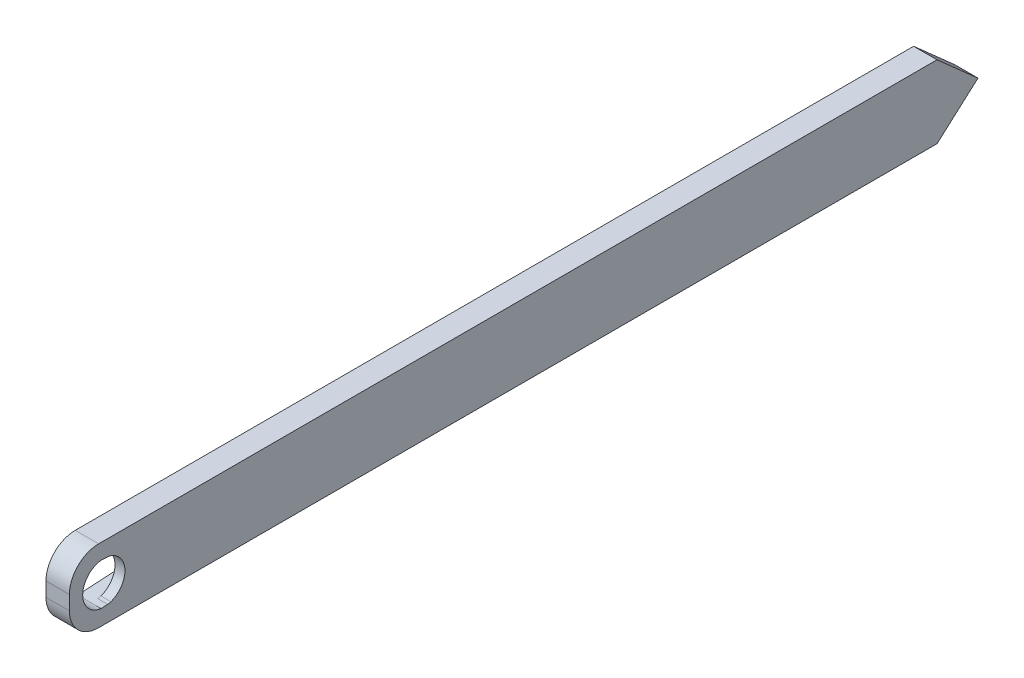
ISO-10303-21;
HEADER;
FILE_DESCRIPTION(('STEP AP214'),'2;1');
FILE_NAME('part.step','',(''),(''),'','','');
FILE_SCHEMA(('AUTOMOTIVE_DESIGN { 1 0 10303 214 1 1 1 1 }'));
ENDSEC;
DATA;
#1=APPLICATION_CONTEXT('core data for automotive mechanical design processes');
#2=APPLICATION_PROTOCOL_DEFINITION('international standard','automotive_design',2000,#1);
#3=PRODUCT_CONTEXT('',#1,'mechanical');
#4=PRODUCT('Part','Part','',(#3));
#5=PRODUCT_RELATED_PRODUCT_CATEGORY('part','',(#4));
#6=PRODUCT_DEFINITION_FORMATION('','',#4);
#7=PRODUCT_DEFINITION_CONTEXT('part definition',#1,'design');
#8=PRODUCT_DEFINITION('design','',#6,#7);
#9=PRODUCT_DEFINITION_SHAPE('','',#8);
#10=(LENGTH_UNIT() NAMED_UNIT(*) SI_UNIT(.MILLI.,.METRE.));
#11=(NAMED_UNIT(*) PLANE_ANGLE_UNIT() SI_UNIT($,.RADIAN.));
#12=(NAMED_UNIT(*) SI_UNIT($,.STERADIAN.) SOLID_ANGLE_UNIT());
#13=UNCERTAINTY_MEASURE_WITH_UNIT(LENGTH_MEASURE(1.E-05),#10,'distance_accuracy_value','');
#14=(GEOMETRIC_REPRESENTATION_CONTEXT(3) GLOBAL_UNCERTAINTY_ASSIGNED_CONTEXT((#13)) GLOBAL_UNIT_ASSIGNED_CONTEXT((#10,
#11,#12)) REPRESENTATION_CONTEXT('',''));
#15=CARTESIAN_POINT('',(0.,0.,0.));
#16=DIRECTION('',(0.,0.,1.));
#17=DIRECTION('',(1.,0.,0.));
#18=AXIS2_PLACEMENT_3D('',#15,#16,#17);
#19=CARTESIAN_POINT('',(4.,0.,0.));
#20=DIRECTION('',(0.,1.,0.));
#21=DIRECTION('',(0.,0.,1.));
#22=AXIS2_PLACEMENT_3D('',#19,#20,#21);
#23=PLANE('',#22);
#24=DIRECTION('',(0.,0.,-1.));
#25=VECTOR('',#24,1.);
#26=CARTESIAN_POINT('',(4.,0.,0.));
#27=LINE('',#26,#25);
#28=CARTESIAN_POINT('',(4.,0.,-5.));
#29=VERTEX_POINT('',#28);
#30=CARTESIAN_POINT('',(4.,0.,-148.25));
#31=VERTEX_POINT('',#30);
#32=EDGE_CURVE('E204',#29,#31,#27,.T.);
#33=ORIENTED_EDGE('',*,*,#32,.F.);
#34=DIRECTION('',(-1.,0.,0.));
#35=VECTOR('',#34,1.);
#36=CARTESIAN_POINT('',(0.,0.,-5.));
#37=LINE('',#36,#35);
#38=CARTESIAN_POINT('',(0.,0.,-5.));
#39=VERTEX_POINT('',#38);
#40=EDGE_CURVE('E252',#29,#39,#37,.T.);
#41=ORIENTED_EDGE('',*,*,#40,.T.);
#42=DIRECTION('',(0.,0.,-1.));
#43=VECTOR('',#42,1.);
#44=CARTESIAN_POINT('',(0.,0.,0.));
#45=LINE('',#44,#43);
#46=CARTESIAN_POINT('',(0.,0.,-148.25));
#47=VERTEX_POINT('',#46);
#48=EDGE_CURVE('E201',#39,#47,#45,.T.);
#49=ORIENTED_EDGE('',*,*,#48,.T.);
#50=DIRECTION('',(-1.,0.,0.));
#51=VECTOR('',#50,1.);
#52=CARTESIAN_POINT('',(4.,0.,-148.25));
#53=LINE('',#52,#51);
#54=EDGE_CURVE('E234',#31,#47,#53,.T.);
#55=ORIENTED_EDGE('',*,*,#54,.F.);
#56=EDGE_LOOP('',(#33,#41,#49,#55));
#57=FACE_BOUND('',#56,.T.);
#58=ADVANCED_FACE('F47',(#57),#23,.F.);
#59=CARTESIAN_POINT('',(4.,-73.596685171206,-65.2907735590273));
#60=DIRECTION('',(0.,-0.748057524733294,-0.66363388979911));
#61=DIRECTION('',(0.,0.66363388979911,-0.748057524733294));
#62=AXIS2_PLACEMENT_3D('',#59,#60,#61);
#63=PLANE('',#62);
#64=DIRECTION('',(0.,-0.66363388979911,0.748057524733294));
#65=VECTOR('',#64,1.);
#66=CARTESIAN_POINT('',(0.,-73.596685171206,-65.2907735590273));
#67=LINE('',#66,#65);
#68=CARTESIAN_POINT('',(0.,6.20999999999998,-155.25));
#69=VERTEX_POINT('',#68);
#70=EDGE_CURVE('E220',#69,#47,#67,.T.);
#71=ORIENTED_EDGE('',*,*,#70,.F.);
#72=DIRECTION('',(-1.,0.,0.));
#73=VECTOR('',#72,1.);
#74=CARTESIAN_POINT('',(4.,6.20999999999998,-155.25));
#75=LINE('',#74,#73);
#76=CARTESIAN_POINT('',(4.,6.20999999999998,-155.25));
#77=VERTEX_POINT('',#76);
#78=EDGE_CURVE('E232',#77,#69,#75,.T.);
#79=ORIENTED_EDGE('',*,*,#78,.F.);
#80=DIRECTION('',(0.,-0.66363388979911,0.748057524733294));
#81=VECTOR('',#80,1.);
#82=CARTESIAN_POINT('',(4.,-73.596685171206,-65.2907735590273));
#83=LINE('',#82,#81);
#84=EDGE_CURVE('E206',#77,#31,#83,.T.);
#85=ORIENTED_EDGE('',*,*,#84,.T.);
#86=ORIENTED_EDGE('',*,*,#54,.T.);
#87=EDGE_LOOP('',(#71,#79,#85,#86));
#88=FACE_BOUND('',#87,.T.);
#89=ADVANCED_FACE('F302',(#88),#63,.T.);
#90=CARTESIAN_POINT('',(4.,80.5467937202575,-71.4565127146858));
#91=DIRECTION('',(0.,0.748057524733294,-0.66363388979911));
#92=DIRECTION('',(0.,0.66363388979911,0.748057524733294));
#93=AXIS2_PLACEMENT_3D('',#90,#91,#92);
#94=PLANE('',#93);
#95=DIRECTION('',(0.,-0.66363388979911,-0.748057524733294));
#96=VECTOR('',#95,1.);
#97=CARTESIAN_POINT('',(0.,80.5467937202575,-71.4565127146858));
#98=LINE('',#97,#96);
#99=CARTESIAN_POINT('',(0.,12.42,-148.25));
#100=VERTEX_POINT('',#99);
#101=EDGE_CURVE('E223',#100,#69,#98,.T.);
#102=ORIENTED_EDGE('',*,*,#101,.F.);
#103=DIRECTION('',(-1.,0.,0.));
#104=VECTOR('',#103,1.);
#105=CARTESIAN_POINT('',(4.,12.42,-148.25));
#106=LINE('',#105,#104);
#107=CARTESIAN_POINT('',(4.,12.42,-148.25));
#108=VERTEX_POINT('',#107);
#109=EDGE_CURVE('E218',#108,#100,#106,.T.);
#110=ORIENTED_EDGE('',*,*,#109,.F.);
#111=DIRECTION('',(0.,-0.66363388979911,-0.748057524733294));
#112=VECTOR('',#111,1.);
#113=CARTESIAN_POINT('',(4.,80.5467937202575,-71.4565127146858));
#114=LINE('',#113,#112);
#115=EDGE_CURVE('E210',#108,#77,#114,.T.);
#116=ORIENTED_EDGE('',*,*,#115,.T.);
#117=ORIENTED_EDGE('',*,*,#78,.T.);
#118=EDGE_LOOP('',(#102,#110,#116,#117));
#119=FACE_BOUND('',#118,.T.);
#120=ADVANCED_FACE('F310',(#119),#94,.T.);
#121=CARTESIAN_POINT('',(4.,12.42,0.));
#122=DIRECTION('',(0.,1.,0.));
#123=DIRECTION('',(0.,0.,1.));
#124=AXIS2_PLACEMENT_3D('',#121,#122,#123);
#125=PLANE('',#124);
#126=DIRECTION('',(0.,0.,-1.));
#127=VECTOR('',#126,1.);
#128=CARTESIAN_POINT('',(0.,12.42,0.));
#129=LINE('',#128,#127);
#130=CARTESIAN_POINT('',(0.,12.42,-5.));
#131=VERTEX_POINT('',#130);
#132=EDGE_CURVE('E226',#131,#100,#129,.T.);
#133=ORIENTED_EDGE('',*,*,#132,.F.);
#134=DIRECTION('',(-1.,0.,0.));
#135=VECTOR('',#134,1.);
#136=CARTESIAN_POINT('',(4.,12.42,-5.));
#137=LINE('',#136,#135);
#138=CARTESIAN_POINT('',(4.,12.42,-5.));
#139=VERTEX_POINT('',#138);
#140=EDGE_CURVE('E246',#131,#139,#137,.F.);
#141=ORIENTED_EDGE('',*,*,#140,.T.);
#142=DIRECTION('',(0.,0.,-1.));
#143=VECTOR('',#142,1.);
#144=CARTESIAN_POINT('',(4.,12.42,0.));
#145=LINE('',#144,#143);
#146=EDGE_CURVE('E213',#139,#108,#145,.T.);
#147=ORIENTED_EDGE('',*,*,#146,.T.);
#148=ORIENTED_EDGE('',*,*,#109,.T.);
#149=EDGE_LOOP('',(#133,#141,#147,#148));
#150=FACE_BOUND('',#149,.T.);
#151=ADVANCED_FACE('F410',(#150),#125,.T.);
#152=CARTESIAN_POINT('',(4.,0.,0.));
#153=DIRECTION('',(0.,0.,1.));
#154=DIRECTION('',(1.,0.,0.));
#155=AXIS2_PLACEMENT_3D('',#152,#153,#154);
#156=PLANE('',#155);
#157=DIRECTION('',(0.,1.,0.));
#158=VECTOR('',#157,1.);
#159=CARTESIAN_POINT('',(4.,0.,0.));
#160=LINE('',#159,#158);
#161=CARTESIAN_POINT('',(4.,5.,0.));
#162=VERTEX_POINT('',#161);
#163=CARTESIAN_POINT('',(4.,7.42,0.));
#164=VERTEX_POINT('',#163);
#165=EDGE_CURVE('E215',#162,#164,#160,.T.);
#166=ORIENTED_EDGE('',*,*,#165,.T.);
#167=DIRECTION('',(-1.,0.,0.));
#168=VECTOR('',#167,1.);
#169=CARTESIAN_POINT('',(4.,7.42,0.));
#170=LINE('',#169,#168);
#171=CARTESIAN_POINT('',(0.,7.42,0.));
#172=VERTEX_POINT('',#171);
#173=EDGE_CURVE('E239',#164,#172,#170,.T.);
#174=ORIENTED_EDGE('',*,*,#173,.T.);
#175=DIRECTION('',(0.,1.,0.));
#176=VECTOR('',#175,1.);
#177=CARTESIAN_POINT('',(0.,0.,0.));
#178=LINE('',#177,#176);
#179=CARTESIAN_POINT('',(0.,5.,0.));
#180=VERTEX_POINT('',#179);
#181=EDGE_CURVE('E207',#180,#172,#178,.T.);
#182=ORIENTED_EDGE('',*,*,#181,.F.);
#183=DIRECTION('',(-1.,0.,0.));
#184=VECTOR('',#183,1.);
#185=CARTESIAN_POINT('',(4.,5.,0.));
#186=LINE('',#185,#184);
#187=EDGE_CURVE('E237',#180,#162,#186,.F.);
#188=ORIENTED_EDGE('',*,*,#187,.T.);
#189=EDGE_LOOP('',(#166,#174,#182,#188));
#190=FACE_BOUND('',#189,.T.);
#191=ADVANCED_FACE('F403',(#190),#156,.T.);
#192=CARTESIAN_POINT('',(4.,0.,0.));
#193=DIRECTION('',(1.,0.,0.));
#194=DIRECTION('',(0.,0.,-1.));
#195=AXIS2_PLACEMENT_3D('',#192,#193,#194);
#196=PLANE('',#195);
#197=DIRECTION('',(0.,-0.0596337664255842,-0.998220323326418));
#198=VECTOR('',#197,1.);
#199=CARTESIAN_POINT('',(4.,10.0775607204516,-0.602034328594348));
#200=LINE('',#199,#198);
#201=CARTESIAN_POINT('',(4.,9.78999999999999,-5.41556485921069));
#202=VERTEX_POINT('',#201);
#203=CARTESIAN_POINT('',(4.,9.72280735048438,-6.54031468376415));
#204=VERTEX_POINT('',#203);
#205=EDGE_CURVE('E185',#202,#204,#200,.T.);
#206=ORIENTED_EDGE('',*,*,#205,.T.);
#207=CARTESIAN_POINT('',(4.,7.72636670383154,-6.42104715091298));
#208=DIRECTION('',(1.,0.,0.));
#209=DIRECTION('',(0.,0.,-1.));
#210=AXIS2_PLACEMENT_3D('',#207,#208,#209);
#211=CIRCLE('',#210,2.);
#212=CARTESIAN_POINT('',(4.,9.61005205020613,-7.0931554129167));
#213=VERTEX_POINT('',#212);
#214=EDGE_CURVE('E12',#204,#213,#211,.F.);
#215=ORIENTED_EDGE('',*,*,#214,.T.);
#216=CARTESIAN_POINT('',(4.,6.21,-5.88));
#217=DIRECTION('',(-1.,0.,0.));
#218=DIRECTION('',(0.,0.,1.));
#219=AXIS2_PLACEMENT_3D('',#216,#217,#218);
#220=CIRCLE('',#219,3.61);
#221=CARTESIAN_POINT('',(4.,2.80994794979384,-7.0931554129166));
#222=VERTEX_POINT('',#221);
#223=EDGE_CURVE('E187',#213,#222,#220,.T.);
#224=ORIENTED_EDGE('',*,*,#223,.T.);
#225=CARTESIAN_POINT('',(4.,4.69363329616844,-6.42104715091294));
#226=DIRECTION('',(1.,0.,0.));
#227=DIRECTION('',(0.,0.,-1.));
#228=AXIS2_PLACEMENT_3D('',#225,#226,#227);
#229=CIRCLE('',#228,2.);
#230=CARTESIAN_POINT('',(4.,2.69719264951561,-6.54031468376411));
#231=VERTEX_POINT('',#230);
#232=EDGE_CURVE('E264',#222,#231,#229,.F.);
#233=ORIENTED_EDGE('',*,*,#232,.T.);
#234=DIRECTION('',(0.,-0.0596337664255851,0.998220323326418));
#235=VECTOR('',#234,1.);
#236=CARTESIAN_POINT('',(4.,2.29827144820995,0.137298930428936));
#237=LINE('',#236,#235);
#238=CARTESIAN_POINT('',(4.,2.62999999999999,-5.41556485921071));
#239=VERTEX_POINT('',#238);
#240=EDGE_CURVE('E191',#231,#239,#237,.T.);
#241=ORIENTED_EDGE('',*,*,#240,.T.);
#242=EDGE_CURVE('E192',#239,#202,#220,.T.);
#243=ORIENTED_EDGE('',*,*,#242,.T.);
#244=EDGE_LOOP('',(#206,#215,#224,#233,#241,#243));
#245=FACE_BOUND('',#244,.T.);
#246=ORIENTED_EDGE('',*,*,#146,.F.);
#247=CARTESIAN_POINT('',(4.,7.42,-5.));
#248=DIRECTION('',(1.,0.,0.));
#249=DIRECTION('',(0.,0.,-1.));
#250=AXIS2_PLACEMENT_3D('',#247,#248,#249);
#251=CIRCLE('',#250,5.);
#252=EDGE_CURVE('E250',#139,#164,#251,.T.);
#253=ORIENTED_EDGE('',*,*,#252,.T.);
#254=ORIENTED_EDGE('',*,*,#165,.F.);
#255=CARTESIAN_POINT('',(4.,5.,-5.));
#256=DIRECTION('',(1.,0.,0.));
#257=DIRECTION('',(0.,0.,-1.));
#258=AXIS2_PLACEMENT_3D('',#255,#256,#257);
#259=CIRCLE('',#258,5.);
#260=EDGE_CURVE('E248',#162,#29,#259,.T.);
#261=ORIENTED_EDGE('',*,*,#260,.T.);
#262=ORIENTED_EDGE('',*,*,#32,.T.);
#263=ORIENTED_EDGE('',*,*,#84,.F.);
#264=ORIENTED_EDGE('',*,*,#115,.F.);
#265=EDGE_LOOP('',(#246,#253,#254,#261,#262,#263,#264));
#266=FACE_BOUND('',#265,.T.);
#267=ADVANCED_FACE('F271',(#245,#266),#196,.T.);
#268=CARTESIAN_POINT('',(0.,0.,0.));
#269=DIRECTION('',(1.,0.,0.));
#270=DIRECTION('',(0.,0.,-1.));
#271=AXIS2_PLACEMENT_3D('',#268,#269,#270);
#272=PLANE('',#271);
#273=DIRECTION('',(0.,-0.0596337664255851,0.998220323326418));
#274=VECTOR('',#273,1.);
#275=CARTESIAN_POINT('',(0.,2.29827144820995,0.137298930428936));
#276=LINE('',#275,#274);
#277=CARTESIAN_POINT('',(0.,3.705,-23.410182873402));
#278=VERTEX_POINT('',#277);
#279=CARTESIAN_POINT('',(0.,2.62999999999999,-5.41556485921071));
#280=VERTEX_POINT('',#279);
#281=EDGE_CURVE('E195',#278,#280,#276,.T.);
#282=ORIENTED_EDGE('',*,*,#281,.F.);
#283=CARTESIAN_POINT('',(0.,6.21,-23.2605339618287));
#284=DIRECTION('',(-1.,0.,0.));
#285=DIRECTION('',(0.,0.,1.));
#286=AXIS2_PLACEMENT_3D('',#283,#284,#285);
#287=CIRCLE('',#286,2.50946603817128);
#288=CARTESIAN_POINT('',(0.,8.715,-23.410182873402));
#289=VERTEX_POINT('',#288);
#290=EDGE_CURVE('E172',#289,#278,#287,.T.);
#291=ORIENTED_EDGE('',*,*,#290,.F.);
#292=DIRECTION('',(0.,-0.0596337664255842,-0.998220323326418));
#293=VECTOR('',#292,1.);
#294=CARTESIAN_POINT('',(0.,10.0775607204516,-0.602034328594348));
#295=LINE('',#294,#293);
#296=CARTESIAN_POINT('',(0.,9.78999999999999,-5.41556485921069));
#297=VERTEX_POINT('',#296);
#298=EDGE_CURVE('E184',#297,#289,#295,.T.);
#299=ORIENTED_EDGE('',*,*,#298,.F.);
#300=CARTESIAN_POINT('',(0.,6.21,-5.88));
#301=DIRECTION('',(-1.,0.,0.));
#302=DIRECTION('',(0.,0.,1.));
#303=AXIS2_PLACEMENT_3D('',#300,#301,#302);
#304=CIRCLE('',#303,3.61);
#305=EDGE_CURVE('E188',#280,#297,#304,.T.);
#306=ORIENTED_EDGE('',*,*,#305,.F.);
#307=EDGE_LOOP('',(#282,#291,#299,#306));
#308=FACE_BOUND('',#307,.T.);
#309=ORIENTED_EDGE('',*,*,#181,.T.);
#310=CARTESIAN_POINT('',(0.,7.42,-5.));
#311=DIRECTION('',(1.,0.,0.));
#312=DIRECTION('',(0.,0.,-1.));
#313=AXIS2_PLACEMENT_3D('',#310,#311,#312);
#314=CIRCLE('',#313,5.);
#315=EDGE_CURVE('E244',#172,#131,#314,.F.);
#316=ORIENTED_EDGE('',*,*,#315,.T.);
#317=ORIENTED_EDGE('',*,*,#132,.T.);
#318=ORIENTED_EDGE('',*,*,#101,.T.);
#319=ORIENTED_EDGE('',*,*,#70,.T.);
#320=ORIENTED_EDGE('',*,*,#48,.F.);
#321=CARTESIAN_POINT('',(0.,5.,-5.));
#322=DIRECTION('',(1.,0.,0.));
#323=DIRECTION('',(0.,0.,-1.));
#324=AXIS2_PLACEMENT_3D('',#321,#322,#323);
#325=CIRCLE('',#324,5.);
#326=EDGE_CURVE('E242',#39,#180,#325,.F.);
#327=ORIENTED_EDGE('',*,*,#326,.T.);
#328=EDGE_LOOP('',(#309,#316,#317,#318,#319,#320,#327));
#329=FACE_BOUND('',#328,.T.);
#330=ADVANCED_FACE('F288',(#308,#329),#272,.F.);
#331=CARTESIAN_POINT('',(4.,10.0775607204516,-0.602034328594348));
#332=DIRECTION('',(0.,0.998220323326418,-0.0596337664255842));
#333=DIRECTION('',(0.,0.0596337664255842,0.998220323326418));
#334=AXIS2_PLACEMENT_3D('',#331,#332,#333);
#335=PLANE('',#334);
#336=DIRECTION('',(0.,-0.0596337664255842,-0.998220323326418));
#337=VECTOR('',#336,1.);
#338=CARTESIAN_POINT('',(2.3,10.0775607204516,-0.602034328594348));
#339=LINE('',#338,#337);
#340=CARTESIAN_POINT('',(2.3,9.72280735048438,-6.54031468376415));
#341=VERTEX_POINT('',#340);
#342=CARTESIAN_POINT('',(2.3,8.715,-23.410182873402));
#343=VERTEX_POINT('',#342);
#344=EDGE_CURVE('E62',#341,#343,#339,.T.);
#345=ORIENTED_EDGE('',*,*,#344,.F.);
#346=DIRECTION('',(1.,0.,0.));
#347=VECTOR('',#346,1.);
#348=CARTESIAN_POINT('',(4.,9.72280735048438,-6.54031468376415));
#349=LINE('',#348,#347);
#350=EDGE_CURVE('E67',#341,#204,#349,.T.);
#351=ORIENTED_EDGE('',*,*,#350,.T.);
#352=ORIENTED_EDGE('',*,*,#205,.F.);
#353=DIRECTION('',(-1.,0.,0.));
#354=VECTOR('',#353,1.);
#355=CARTESIAN_POINT('',(4.,9.78999999999999,-5.41556485921069));
#356=LINE('',#355,#354);
#357=EDGE_CURVE('E199',#202,#297,#356,.T.);
#358=ORIENTED_EDGE('',*,*,#357,.T.);
#359=ORIENTED_EDGE('',*,*,#298,.T.);
#360=DIRECTION('',(-1.,0.,0.));
#361=VECTOR('',#360,1.);
#362=CARTESIAN_POINT('',(24.2504211409163,8.715,-23.410182873402));
#363=LINE('',#362,#361);
#364=EDGE_CURVE('E180',#343,#289,#363,.T.);
#365=ORIENTED_EDGE('',*,*,#364,.F.);
#366=EDGE_LOOP('',(#345,#351,#352,#358,#359,#365));
#367=FACE_BOUND('',#366,.T.);
#368=ADVANCED_FACE('F286',(#367),#335,.F.);
#369=CARTESIAN_POINT('',(4.,6.21,-5.88));
#370=DIRECTION('',(-1.,0.,0.));
#371=DIRECTION('',(0.,0.,1.));
#372=AXIS2_PLACEMENT_3D('',#369,#370,#371);
#373=CYLINDRICAL_SURFACE('',#372,3.61);
#374=ORIENTED_EDGE('',*,*,#305,.T.);
#375=ORIENTED_EDGE('',*,*,#357,.F.);
#376=ORIENTED_EDGE('',*,*,#242,.F.);
#377=DIRECTION('',(-1.,0.,0.));
#378=VECTOR('',#377,1.);
#379=CARTESIAN_POINT('',(4.,2.62999999999999,-5.41556485921071));
#380=LINE('',#379,#378);
#381=EDGE_CURVE('E202',#239,#280,#380,.T.);
#382=ORIENTED_EDGE('',*,*,#381,.T.);
#383=EDGE_LOOP('',(#374,#375,#376,#382));
#384=FACE_BOUND('',#383,.T.);
#385=ADVANCED_FACE('F284',(#384),#373,.F.);
#386=CARTESIAN_POINT('',(4.,2.29827144820995,0.137298930428936));
#387=DIRECTION('',(0.,-0.998220323326418,-0.0596337664255851));
#388=DIRECTION('',(0.,0.0596337664255851,-0.998220323326418));
#389=AXIS2_PLACEMENT_3D('',#386,#387,#388);
#390=PLANE('',#389);
#391=ORIENTED_EDGE('',*,*,#240,.F.);
#392=DIRECTION('',(1.,0.,0.));
#393=VECTOR('',#392,1.);
#394=CARTESIAN_POINT('',(2.3,2.69719264951561,-6.54031468376411));
#395=LINE('',#394,#393);
#396=CARTESIAN_POINT('',(2.3,2.69719264951561,-6.54031468376411));
#397=VERTEX_POINT('',#396);
#398=EDGE_CURVE('E162',#231,#397,#395,.F.);
#399=ORIENTED_EDGE('',*,*,#398,.T.);
#400=DIRECTION('',(0.,-0.0596337664255851,0.998220323326418));
#401=VECTOR('',#400,1.);
#402=CARTESIAN_POINT('',(2.3,2.29827144820995,0.137298930428936));
#403=LINE('',#402,#401);
#404=CARTESIAN_POINT('',(2.3,3.705,-23.410182873402));
#405=VERTEX_POINT('',#404);
#406=EDGE_CURVE('E154',#405,#397,#403,.T.);
#407=ORIENTED_EDGE('',*,*,#406,.F.);
#408=DIRECTION('',(-1.,0.,0.));
#409=VECTOR('',#408,1.);
#410=CARTESIAN_POINT('',(24.2504211409163,3.705,-23.410182873402));
#411=LINE('',#410,#409);
#412=EDGE_CURVE('E159',#405,#278,#411,.T.);
#413=ORIENTED_EDGE('',*,*,#412,.T.);
#414=ORIENTED_EDGE('',*,*,#281,.T.);
#415=ORIENTED_EDGE('',*,*,#381,.F.);
#416=EDGE_LOOP('',(#391,#399,#407,#413,#414,#415));
#417=FACE_BOUND('',#416,.T.);
#418=ADVANCED_FACE('F157',(#417),#390,.F.);
#419=CARTESIAN_POINT('',(2.3,6.21,-5.88));
#420=DIRECTION('',(1.,0.,0.));
#421=DIRECTION('',(0.,0.,-1.));
#422=AXIS2_PLACEMENT_3D('',#419,#420,#421);
#423=CIRCLE('',#422,3.61);
#424=CARTESIAN_POINT('',(2.3,9.61005205020613,-7.0931554129167));
#425=VERTEX_POINT('',#424);
#426=CARTESIAN_POINT('',(2.3,2.80994794979384,-7.0931554129166));
#427=VERTEX_POINT('',#426);
#428=EDGE_CURVE('E176',#425,#427,#423,.F.);
#429=ORIENTED_EDGE('',*,*,#428,.T.);
#430=DIRECTION('',(-1.,0.,0.));
#431=VECTOR('',#430,1.);
#432=CARTESIAN_POINT('',(4.,2.80994794979384,-7.0931554129166));
#433=LINE('',#432,#431);
#434=EDGE_CURVE('E259',#427,#222,#433,.F.);
#435=ORIENTED_EDGE('',*,*,#434,.T.);
#436=ORIENTED_EDGE('',*,*,#223,.F.);
#437=DIRECTION('',(-1.,0.,0.));
#438=VECTOR('',#437,1.);
#439=CARTESIAN_POINT('',(4.,9.61005205020613,-7.0931554129167));
#440=LINE('',#439,#438);
#441=EDGE_CURVE('E256',#213,#425,#440,.T.);
#442=ORIENTED_EDGE('',*,*,#441,.T.);
#443=EDGE_LOOP('',(#429,#435,#436,#442));
#444=FACE_BOUND('',#443,.T.);
#445=ADVANCED_FACE('F276',(#444),#373,.F.);
#446=CARTESIAN_POINT('',(2.3,0.,0.));
#447=DIRECTION('',(1.,0.,0.));
#448=DIRECTION('',(0.,0.,-1.));
#449=AXIS2_PLACEMENT_3D('',#446,#447,#448);
#450=PLANE('',#449);
#451=ORIENTED_EDGE('',*,*,#344,.T.);
#452=CARTESIAN_POINT('',(2.3,6.21,-23.2605339618287));
#453=DIRECTION('',(1.,0.,0.));
#454=DIRECTION('',(0.,0.,-1.));
#455=AXIS2_PLACEMENT_3D('',#452,#453,#454);
#456=CIRCLE('',#455,2.50946603817128);
#457=EDGE_CURVE('E170',#343,#405,#456,.F.);
#458=ORIENTED_EDGE('',*,*,#457,.T.);
#459=ORIENTED_EDGE('',*,*,#406,.T.);
#460=CARTESIAN_POINT('',(2.3,4.69363329616844,-6.42104715091294));
#461=DIRECTION('',(1.,0.,0.));
#462=DIRECTION('',(0.,0.,-1.));
#463=AXIS2_PLACEMENT_3D('',#460,#461,#462);
#464=CIRCLE('',#463,2.);
#465=EDGE_CURVE('E262',#397,#427,#464,.T.);
#466=ORIENTED_EDGE('',*,*,#465,.T.);
#467=ORIENTED_EDGE('',*,*,#428,.F.);
#468=CARTESIAN_POINT('',(2.3,7.72636670383154,-6.42104715091298));
#469=DIRECTION('',(1.,0.,0.));
#470=DIRECTION('',(0.,0.,-1.));
#471=AXIS2_PLACEMENT_3D('',#468,#469,#470);
#472=CIRCLE('',#471,2.);
#473=EDGE_CURVE('E55',#425,#341,#472,.T.);
#474=ORIENTED_EDGE('',*,*,#473,.T.);
#475=EDGE_LOOP('',(#451,#458,#459,#466,#467,#474));
#476=FACE_BOUND('',#475,.T.);
#477=ADVANCED_FACE('F174',(#476),#450,.F.);
#478=CARTESIAN_POINT('',(24.2504211409163,6.21,-23.2605339618287));
#479=DIRECTION('',(-1.,0.,0.));
#480=DIRECTION('',(0.,0.,1.));
#481=AXIS2_PLACEMENT_3D('',#478,#479,#480);
#482=CYLINDRICAL_SURFACE('',#481,2.50946603817128);
#483=ORIENTED_EDGE('',*,*,#364,.T.);
#484=ORIENTED_EDGE('',*,*,#290,.T.);
#485=ORIENTED_EDGE('',*,*,#412,.F.);
#486=ORIENTED_EDGE('',*,*,#457,.F.);
#487=EDGE_LOOP('',(#483,#484,#485,#486));
#488=FACE_BOUND('',#487,.T.);
#489=ADVANCED_FACE('F169',(#488),#482,.F.);
#490=CARTESIAN_POINT('',(4.,7.42,-5.));
#491=DIRECTION('',(-1.,0.,0.));
#492=DIRECTION('',(0.,0.,1.));
#493=AXIS2_PLACEMENT_3D('',#490,#491,#492);
#494=CYLINDRICAL_SURFACE('',#493,5.);
#495=ORIENTED_EDGE('',*,*,#252,.F.);
#496=ORIENTED_EDGE('',*,*,#140,.F.);
#497=ORIENTED_EDGE('',*,*,#315,.F.);
#498=ORIENTED_EDGE('',*,*,#173,.F.);
#499=EDGE_LOOP('',(#495,#496,#497,#498));
#500=FACE_BOUND('',#499,.T.);
#501=ADVANCED_FACE('F316',(#500),#494,.T.);
#502=CARTESIAN_POINT('',(4.,5.,-5.));
#503=DIRECTION('',(1.,0.,0.));
#504=DIRECTION('',(0.,0.,-1.));
#505=AXIS2_PLACEMENT_3D('',#502,#503,#504);
#506=CYLINDRICAL_SURFACE('',#505,5.);
#507=ORIENTED_EDGE('',*,*,#260,.F.);
#508=ORIENTED_EDGE('',*,*,#187,.F.);
#509=ORIENTED_EDGE('',*,*,#326,.F.);
#510=ORIENTED_EDGE('',*,*,#40,.F.);
#511=EDGE_LOOP('',(#507,#508,#509,#510));
#512=FACE_BOUND('',#511,.T.);
#513=ADVANCED_FACE('F319',(#512),#506,.T.);
#514=CARTESIAN_POINT('',(4.,4.69363329616844,-6.42104715091294));
#515=DIRECTION('',(-1.,0.,0.));
#516=DIRECTION('',(0.,0.,1.));
#517=AXIS2_PLACEMENT_3D('',#514,#515,#516);
#518=CYLINDRICAL_SURFACE('',#517,2.);
#519=ORIENTED_EDGE('',*,*,#232,.F.);
#520=ORIENTED_EDGE('',*,*,#434,.F.);
#521=ORIENTED_EDGE('',*,*,#465,.F.);
#522=ORIENTED_EDGE('',*,*,#398,.F.);
#523=EDGE_LOOP('',(#519,#520,#521,#522));
#524=FACE_BOUND('',#523,.T.);
#525=ADVANCED_FACE('F279',(#524),#518,.F.);
#526=CARTESIAN_POINT('',(4.,7.72636670383154,-6.42104715091298));
#527=DIRECTION('',(-1.,0.,0.));
#528=DIRECTION('',(0.,0.,1.));
#529=AXIS2_PLACEMENT_3D('',#526,#527,#528);
#530=CYLINDRICAL_SURFACE('',#529,2.);
#531=ORIENTED_EDGE('',*,*,#214,.F.);
#532=ORIENTED_EDGE('',*,*,#350,.F.);
#533=ORIENTED_EDGE('',*,*,#473,.F.);
#534=ORIENTED_EDGE('',*,*,#441,.F.);
#535=EDGE_LOOP('',(#531,#532,#533,#534));
#536=FACE_BOUND('',#535,.T.);
#537=ADVANCED_FACE('F49',(#536),#530,.F.);
#538=CLOSED_SHELL('',(#58,#89,#120,#151,#191,#267,#330,#368,#385,#418,#445,#477,#489,#501,#513,
#525,#537));
#539=MANIFOLD_SOLID_BREP('B2',#538);
#540=ADVANCED_BREP_SHAPE_REPRESENTATION('',(#18,#539),#14);
#541=SHAPE_DEFINITION_REPRESENTATION(#9,#540);
ENDSEC;
END-ISO-10303-21;
